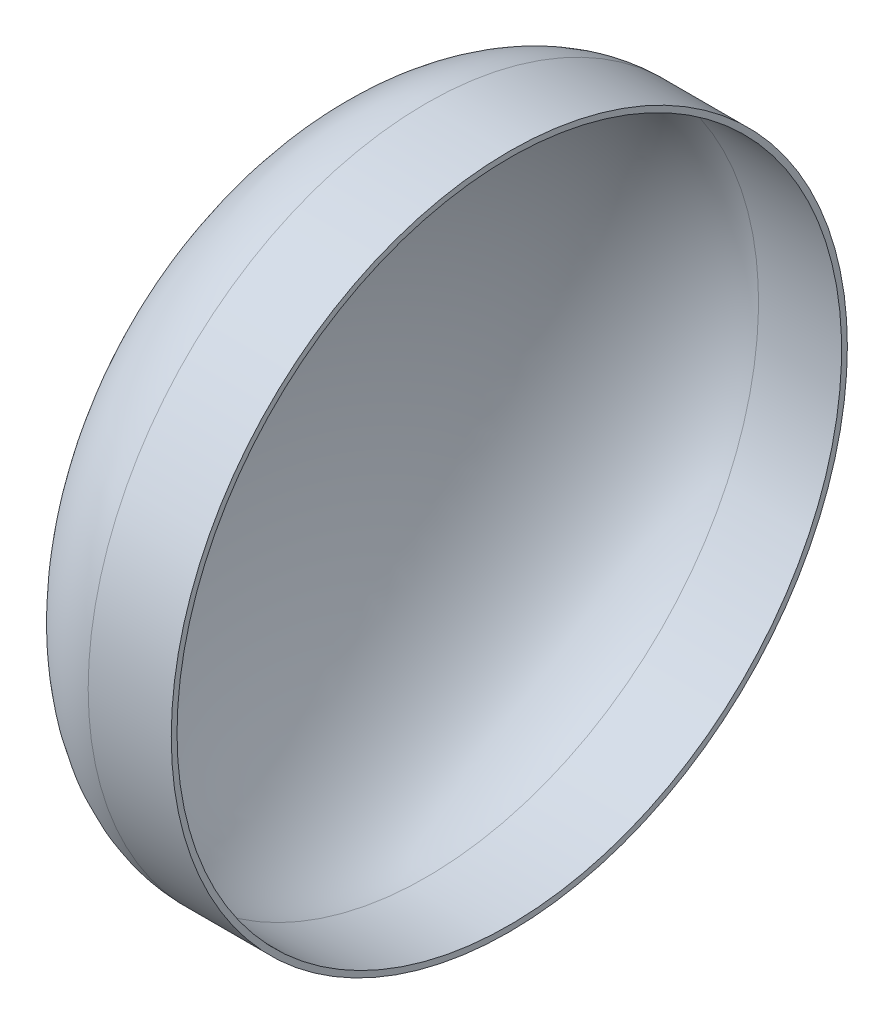
ISO-10303-21;
HEADER;
FILE_DESCRIPTION(('STEP AP214'),'2;1');
FILE_NAME('part.step','',(''),(''),'','','');
FILE_SCHEMA(('AUTOMOTIVE_DESIGN { 1 0 10303 214 1 1 1 1 }'));
ENDSEC;
DATA;
#1=APPLICATION_CONTEXT('core data for automotive mechanical design processes');
#2=APPLICATION_PROTOCOL_DEFINITION('international standard','automotive_design',2000,#1);
#3=PRODUCT_CONTEXT('',#1,'mechanical');
#4=PRODUCT('Part','Part','',(#3));
#5=PRODUCT_RELATED_PRODUCT_CATEGORY('part','',(#4));
#6=PRODUCT_DEFINITION_FORMATION('','',#4);
#7=PRODUCT_DEFINITION_CONTEXT('part definition',#1,'design');
#8=PRODUCT_DEFINITION('design','',#6,#7);
#9=PRODUCT_DEFINITION_SHAPE('','',#8);
#10=(LENGTH_UNIT() NAMED_UNIT(*) SI_UNIT(.MILLI.,.METRE.));
#11=(NAMED_UNIT(*) PLANE_ANGLE_UNIT() SI_UNIT($,.RADIAN.));
#12=(NAMED_UNIT(*) SI_UNIT($,.STERADIAN.) SOLID_ANGLE_UNIT());
#13=UNCERTAINTY_MEASURE_WITH_UNIT(LENGTH_MEASURE(1.E-05),#10,'distance_accuracy_value','');
#14=(GEOMETRIC_REPRESENTATION_CONTEXT(3) GLOBAL_UNCERTAINTY_ASSIGNED_CONTEXT((#13)) GLOBAL_UNIT_ASSIGNED_CONTEXT((#10,
#11,#12)) REPRESENTATION_CONTEXT('',''));
#15=CARTESIAN_POINT('',(0.,0.,0.));
#16=DIRECTION('',(0.,0.,1.));
#17=DIRECTION('',(1.,0.,0.));
#18=AXIS2_PLACEMENT_3D('',#15,#16,#17);
#19=CARTESIAN_POINT('',(-57.5,0.,0.));
#20=DIRECTION('',(-1.,0.,0.));
#21=DIRECTION('',(0.,0.,1.));
#22=AXIS2_PLACEMENT_3D('',#19,#20,#21);
#23=CYLINDRICAL_SURFACE('',#22,117.);
#24=CARTESIAN_POINT('',(0.,0.,0.));
#25=DIRECTION('',(-1.,0.,0.));
#26=DIRECTION('',(0.,1.,0.));
#27=AXIS2_PLACEMENT_3D('',#24,#25,#26);
#28=CIRCLE('',#27,117.);
#29=CARTESIAN_POINT('',(0.,117.,0.));
#30=VERTEX_POINT('',#29);
#31=EDGE_CURVE('E11',#30,#30,#28,.T.);
#32=ORIENTED_EDGE('',*,*,#31,.F.);
#33=EDGE_LOOP('',(#32));
#34=FACE_BOUND('',#33,.T.);
#35=CARTESIAN_POINT('',(28.75,0.,0.));
#36=DIRECTION('',(-1.,0.,0.));
#37=DIRECTION('',(0.,0.,1.));
#38=AXIS2_PLACEMENT_3D('',#35,#36,#37);
#39=CIRCLE('',#38,117.);
#40=CARTESIAN_POINT('',(28.75,0.,117.));
#41=VERTEX_POINT('',#40);
#42=EDGE_CURVE('E43',#41,#41,#39,.T.);
#43=ORIENTED_EDGE('',*,*,#42,.T.);
#44=EDGE_LOOP('',(#43));
#45=FACE_BOUND('',#44,.T.);
#46=ADVANCED_FACE('F34',(#34,#45),#23,.T.);
#47=CARTESIAN_POINT('',(0.,0.,0.));
#48=DIRECTION('',(0.,0.,1.));
#49=DIRECTION('',(0.,-1.,0.));
#50=AXIS2_PLACEMENT_3D('',#47,#48,#49);
#51=ELLIPSE('',#50,115.,57.5);
#52=TRIMMED_CURVE('',#51,(PARAMETER_VALUE(1.5707963267949)),(PARAMETER_VALUE(4.71238898038469)),
.T.,.PARAMETER.);
#53=CARTESIAN_POINT('',(-57.5,0.,0.));
#54=DIRECTION('',(-1.,0.,0.));
#55=AXIS1_PLACEMENT('',#53,#54);
#56=SURFACE_OF_REVOLUTION('',#52,#55);
#57=OFFSET_SURFACE('',#56,2.,.F.);
#58=CARTESIAN_POINT('',(-59.5,0.,0.));
#59=VERTEX_POINT('',#58);
#60=VERTEX_LOOP('',#59);
#61=FACE_BOUND('',#60,.T.);
#62=ORIENTED_EDGE('',*,*,#31,.T.);
#63=EDGE_LOOP('',(#62));
#64=FACE_BOUND('',#63,.T.);
#65=ADVANCED_FACE('F72',(#61,#64),#57,.T.);
#66=CARTESIAN_POINT('',(28.75,0.,0.));
#67=DIRECTION('',(-1.,0.,0.));
#68=DIRECTION('',(0.,0.,1.));
#69=AXIS2_PLACEMENT_3D('',#66,#67,#68);
#70=PLANE('',#69);
#71=CARTESIAN_POINT('',(28.75,0.,0.));
#72=DIRECTION('',(-1.,0.,0.));
#73=DIRECTION('',(0.,0.,1.));
#74=AXIS2_PLACEMENT_3D('',#71,#72,#73);
#75=CIRCLE('',#74,115.);
#76=CARTESIAN_POINT('',(28.75,0.,115.));
#77=VERTEX_POINT('',#76);
#78=EDGE_CURVE('E59',#77,#77,#75,.T.);
#79=ORIENTED_EDGE('',*,*,#78,.T.);
#80=EDGE_LOOP('',(#79));
#81=FACE_BOUND('',#80,.T.);
#82=ORIENTED_EDGE('',*,*,#42,.F.);
#83=EDGE_LOOP('',(#82));
#84=FACE_BOUND('',#83,.T.);
#85=ADVANCED_FACE('F69',(#81,#84),#70,.F.);
#86=CARTESIAN_POINT('',(-57.5,0.,0.));
#87=DIRECTION('',(-1.,0.,0.));
#88=DIRECTION('',(0.,0.,1.));
#89=AXIS2_PLACEMENT_3D('',#86,#87,#88);
#90=CYLINDRICAL_SURFACE('',#89,115.);
#91=CARTESIAN_POINT('',(0.,0.,0.));
#92=DIRECTION('',(-1.,0.,0.));
#93=DIRECTION('',(0.,0.,1.));
#94=AXIS2_PLACEMENT_3D('',#91,#92,#93);
#95=CIRCLE('',#94,115.);
#96=CARTESIAN_POINT('',(0.,0.,115.));
#97=VERTEX_POINT('',#96);
#98=EDGE_CURVE('E57',#97,#97,#95,.T.);
#99=ORIENTED_EDGE('',*,*,#98,.T.);
#100=EDGE_LOOP('',(#99));
#101=FACE_BOUND('',#100,.T.);
#102=ORIENTED_EDGE('',*,*,#78,.F.);
#103=EDGE_LOOP('',(#102));
#104=FACE_BOUND('',#103,.T.);
#105=ADVANCED_FACE('F53',(#101,#104),#90,.F.);
#106=CARTESIAN_POINT('',(0.,0.,0.));
#107=DIRECTION('',(0.,0.,1.));
#108=DIRECTION('',(0.,-1.,0.));
#109=AXIS2_PLACEMENT_3D('',#106,#107,#108);
#110=ELLIPSE('',#109,115.,57.5);
#111=TRIMMED_CURVE('',#110,(PARAMETER_VALUE(1.5707963267949)),
(PARAMETER_VALUE(4.71238898038469)),.T.,.PARAMETER.);
#112=CARTESIAN_POINT('',(-57.5,0.,0.));
#113=DIRECTION('',(-1.,0.,0.));
#114=AXIS1_PLACEMENT('',#112,#113);
#115=SURFACE_OF_REVOLUTION('',#111,#114);
#116=CARTESIAN_POINT('',(-57.5,0.,0.));
#117=VERTEX_POINT('',#116);
#118=VERTEX_LOOP('',#117);
#119=FACE_BOUND('',#118,.T.);
#120=ORIENTED_EDGE('',*,*,#98,.F.);
#121=EDGE_LOOP('',(#120));
#122=FACE_BOUND('',#121,.T.);
#123=ADVANCED_FACE('F50',(#119,#122),#115,.F.);
#124=CLOSED_SHELL('',(#46,#65,#85,#105,#123));
#125=MANIFOLD_SOLID_BREP('B2',#124);
#126=ADVANCED_BREP_SHAPE_REPRESENTATION('',(#18,#125),#14);
#127=SHAPE_DEFINITION_REPRESENTATION(#9,#126);
ENDSEC;
END-ISO-10303-21;
